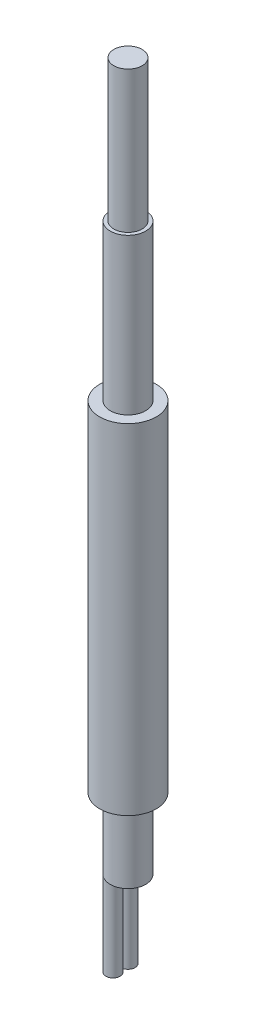
ISO-10303-21;
HEADER;
FILE_DESCRIPTION(('STEP AP214'),'2;1');
FILE_NAME('part.step','',(''),(''),'','','');
FILE_SCHEMA(('AUTOMOTIVE_DESIGN { 1 0 10303 214 1 1 1 1 }'));
ENDSEC;
DATA;
#1=APPLICATION_CONTEXT('core data for automotive mechanical design processes');
#2=APPLICATION_PROTOCOL_DEFINITION('international standard','automotive_design',2000,#1);
#3=PRODUCT_CONTEXT('',#1,'mechanical');
#4=PRODUCT('Part','Part','',(#3));
#5=PRODUCT_RELATED_PRODUCT_CATEGORY('part','',(#4));
#6=PRODUCT_DEFINITION_FORMATION('','',#4);
#7=PRODUCT_DEFINITION_CONTEXT('part definition',#1,'design');
#8=PRODUCT_DEFINITION('design','',#6,#7);
#9=PRODUCT_DEFINITION_SHAPE('','',#8);
#10=(LENGTH_UNIT() NAMED_UNIT(*) SI_UNIT(.MILLI.,.METRE.));
#11=(NAMED_UNIT(*) PLANE_ANGLE_UNIT() SI_UNIT($,.RADIAN.));
#12=(NAMED_UNIT(*) SI_UNIT($,.STERADIAN.) SOLID_ANGLE_UNIT());
#13=UNCERTAINTY_MEASURE_WITH_UNIT(LENGTH_MEASURE(1.E-05),#10,'distance_accuracy_value','');
#14=(GEOMETRIC_REPRESENTATION_CONTEXT(3) GLOBAL_UNCERTAINTY_ASSIGNED_CONTEXT((#13)) GLOBAL_UNIT_ASSIGNED_CONTEXT((#10,
#11,#12)) REPRESENTATION_CONTEXT('',''));
#15=CARTESIAN_POINT('',(0.,0.,0.));
#16=DIRECTION('',(0.,0.,1.));
#17=DIRECTION('',(1.,0.,0.));
#18=AXIS2_PLACEMENT_3D('',#15,#16,#17);
#19=CARTESIAN_POINT('',(0.,14.5,0.));
#20=DIRECTION('',(0.,1.,0.));
#21=DIRECTION('',(0.,0.,1.));
#22=AXIS2_PLACEMENT_3D('',#19,#20,#21);
#23=PLANE('',#22);
#24=CARTESIAN_POINT('',(0.,14.5,0.));
#25=DIRECTION('',(0.,1.,0.));
#26=DIRECTION('',(0.,0.,1.));
#27=AXIS2_PLACEMENT_3D('',#24,#25,#26);
#28=CIRCLE('',#27,1.);
#29=CARTESIAN_POINT('',(0.,14.5,1.));
#30=VERTEX_POINT('',#29);
#31=EDGE_CURVE('E12',#30,#30,#28,.T.);
#32=ORIENTED_EDGE('',*,*,#31,.T.);
#33=EDGE_LOOP('',(#32));
#34=FACE_BOUND('',#33,.T.);
#35=CARTESIAN_POINT('',(0.,14.5,0.));
#36=DIRECTION('',(0.,1.,0.));
#37=DIRECTION('',(1.,0.,0.));
#38=AXIS2_PLACEMENT_3D('',#35,#36,#37);
#39=CIRCLE('',#38,0.625);
#40=CARTESIAN_POINT('',(0.625,14.5,0.));
#41=VERTEX_POINT('',#40);
#42=EDGE_CURVE('E59',#41,#41,#39,.T.);
#43=ORIENTED_EDGE('',*,*,#42,.F.);
#44=EDGE_LOOP('',(#43));
#45=FACE_BOUND('',#44,.T.);
#46=ADVANCED_FACE('F48',(#34,#45),#23,.T.);
#47=CARTESIAN_POINT('',(0.,2.5,0.));
#48=DIRECTION('',(0.,1.,0.));
#49=DIRECTION('',(0.,0.,1.));
#50=AXIS2_PLACEMENT_3D('',#47,#48,#49);
#51=PLANE('',#50);
#52=CARTESIAN_POINT('',(0.,2.5,0.));
#53=DIRECTION('',(0.,1.,0.));
#54=DIRECTION('',(0.,0.,1.));
#55=AXIS2_PLACEMENT_3D('',#52,#53,#54);
#56=CIRCLE('',#55,1.);
#57=CARTESIAN_POINT('',(0.,2.5,1.));
#58=VERTEX_POINT('',#57);
#59=EDGE_CURVE('E52',#58,#58,#56,.T.);
#60=ORIENTED_EDGE('',*,*,#59,.F.);
#61=EDGE_LOOP('',(#60));
#62=FACE_BOUND('',#61,.T.);
#63=CARTESIAN_POINT('',(0.,2.5,0.));
#64=DIRECTION('',(0.,1.,0.));
#65=DIRECTION('',(1.,0.,0.));
#66=AXIS2_PLACEMENT_3D('',#63,#64,#65);
#67=CIRCLE('',#66,0.625);
#68=CARTESIAN_POINT('',(0.625,2.5,0.));
#69=VERTEX_POINT('',#68);
#70=EDGE_CURVE('E61',#69,#69,#67,.T.);
#71=ORIENTED_EDGE('',*,*,#70,.T.);
#72=EDGE_LOOP('',(#71));
#73=FACE_BOUND('',#72,.T.);
#74=ADVANCED_FACE('F71',(#62,#73),#51,.F.);
#75=CARTESIAN_POINT('',(0.,14.5,0.));
#76=DIRECTION('',(0.,-1.,0.));
#77=DIRECTION('',(0.,0.,-1.));
#78=AXIS2_PLACEMENT_3D('',#75,#76,#77);
#79=CYLINDRICAL_SURFACE('',#78,1.);
#80=ORIENTED_EDGE('',*,*,#31,.F.);
#81=EDGE_LOOP('',(#80));
#82=FACE_BOUND('',#81,.T.);
#83=ORIENTED_EDGE('',*,*,#59,.T.);
#84=EDGE_LOOP('',(#83));
#85=FACE_BOUND('',#84,.T.);
#86=ADVANCED_FACE('F50',(#82,#85),#79,.T.);
#87=CARTESIAN_POINT('',(0.,14.5,0.));
#88=DIRECTION('',(0.,-1.,0.));
#89=DIRECTION('',(0.,0.,-1.));
#90=AXIS2_PLACEMENT_3D('',#87,#88,#89);
#91=CYLINDRICAL_SURFACE('',#90,0.625);
#92=ORIENTED_EDGE('',*,*,#42,.T.);
#93=EDGE_LOOP('',(#92));
#94=FACE_BOUND('',#93,.T.);
#95=ORIENTED_EDGE('',*,*,#70,.F.);
#96=EDGE_LOOP('',(#95));
#97=FACE_BOUND('',#96,.T.);
#98=ADVANCED_FACE('F67',(#94,#97),#91,.F.);
#99=CLOSED_SHELL('',(#46,#74,#86,#98));
#100=MANIFOLD_SOLID_BREP('B2',#99);
#101=CARTESIAN_POINT('',(0.,-1.4142135623731,0.));
#102=DIRECTION('',(0.,1.,0.));
#103=DIRECTION('',(0.,0.,1.));
#104=AXIS2_PLACEMENT_3D('',#101,#102,#103);
#105=CYLINDRICAL_SURFACE('',#104,0.5);
#106=CARTESIAN_POINT('',(0.,0.,0.));
#107=DIRECTION('',(0.,1.,0.));
#108=DIRECTION('',(0.,0.,1.));
#109=AXIS2_PLACEMENT_3D('',#106,#107,#108);
#110=CIRCLE('',#109,0.5);
#111=CARTESIAN_POINT('',(0.,0.,0.5));
#112=VERTEX_POINT('',#111);
#113=EDGE_CURVE('E47',#112,#112,#110,.F.);
#114=ORIENTED_EDGE('',*,*,#113,.F.);
#115=EDGE_LOOP('',(#114));
#116=FACE_BOUND('',#115,.T.);
#117=CARTESIAN_POINT('',(0.,25.,0.));
#118=DIRECTION('',(0.,1.,0.));
#119=DIRECTION('',(0.,0.,1.));
#120=AXIS2_PLACEMENT_3D('',#117,#118,#119);
#121=CIRCLE('',#120,0.5);
#122=CARTESIAN_POINT('',(0.,25.,0.5));
#123=VERTEX_POINT('',#122);
#124=EDGE_CURVE('E125',#123,#123,#121,.T.);
#125=ORIENTED_EDGE('',*,*,#124,.F.);
#126=EDGE_LOOP('',(#125));
#127=FACE_BOUND('',#126,.T.);
#128=ADVANCED_FACE('F119',(#116,#127),#105,.T.);
#129=CARTESIAN_POINT('',(0.,0.,0.));
#130=DIRECTION('',(0.,1.,0.));
#131=DIRECTION('',(0.,0.,1.));
#132=AXIS2_PLACEMENT_3D('',#129,#130,#131);
#133=PLANE('',#132);
#134=ORIENTED_EDGE('',*,*,#113,.T.);
#135=EDGE_LOOP('',(#134));
#136=FACE_BOUND('',#135,.T.);
#137=ADVANCED_FACE('F134',(#136),#133,.F.);
#138=CARTESIAN_POINT('',(0.,25.,0.));
#139=DIRECTION('',(0.,1.,0.));
#140=DIRECTION('',(0.,0.,1.));
#141=AXIS2_PLACEMENT_3D('',#138,#139,#140);
#142=PLANE('',#141);
#143=ORIENTED_EDGE('',*,*,#124,.T.);
#144=EDGE_LOOP('',(#143));
#145=FACE_BOUND('',#144,.T.);
#146=ADVANCED_FACE('F131',(#145),#142,.T.);
#147=CLOSED_SHELL('',(#128,#137,#146));
#148=MANIFOLD_SOLID_BREP('B7',#147);
#149=CARTESIAN_POINT('',(0.,0.,0.));
#150=DIRECTION('',(0.,1.,0.));
#151=DIRECTION('',(0.,0.,1.));
#152=AXIS2_PLACEMENT_3D('',#149,#150,#151);
#153=PLANE('',#152);
#154=CARTESIAN_POINT('',(-0.265165042944956,0.,0.265165042944955));
#155=DIRECTION('',(0.,-1.,0.));
#156=DIRECTION('',(0.,0.,1.));
#157=AXIS2_PLACEMENT_3D('',#154,#155,#156);
#158=CIRCLE('',#157,0.25);
#159=CARTESIAN_POINT('',(-0.441941738241593,0.,0.441941738241591));
#160=VERTEX_POINT('',#159);
#161=CARTESIAN_POINT('',(-0.480522515989479,0.,0.138195917548749));
#162=VERTEX_POINT('',#161);
#163=EDGE_CURVE('E178',#160,#162,#158,.T.);
#164=ORIENTED_EDGE('',*,*,#163,.F.);
#165=CARTESIAN_POINT('',(0.,0.,0.));
#166=DIRECTION('',(0.,1.,0.));
#167=DIRECTION('',(0.,0.,1.));
#168=AXIS2_PLACEMENT_3D('',#165,#166,#167);
#169=CIRCLE('',#168,0.625);
#170=CARTESIAN_POINT('',(-0.441941738241593,0.,-0.441941738241592));
#171=VERTEX_POINT('',#170);
#172=EDGE_CURVE('E164',#171,#160,#169,.T.);
#173=ORIENTED_EDGE('',*,*,#172,.F.);
#174=CARTESIAN_POINT('',(-0.265165042944956,0.,-0.265165042944955));
#175=DIRECTION('',(0.,-1.,0.));
#176=DIRECTION('',(0.,0.,-1.));
#177=AXIS2_PLACEMENT_3D('',#174,#175,#176);
#178=CIRCLE('',#177,0.25);
#179=CARTESIAN_POINT('',(-0.480522515989479,0.,-0.13819591754875));
#180=VERTEX_POINT('',#179);
#181=EDGE_CURVE('E117',#180,#171,#178,.T.);
#182=ORIENTED_EDGE('',*,*,#181,.F.);
#183=CARTESIAN_POINT('',(0.,0.,0.));
#184=DIRECTION('',(0.,1.,0.));
#185=DIRECTION('',(0.,0.,1.));
#186=AXIS2_PLACEMENT_3D('',#183,#184,#185);
#187=CIRCLE('',#186,0.5);
#188=EDGE_CURVE('E220',#180,#162,#187,.T.);
#189=ORIENTED_EDGE('',*,*,#188,.T.);
#190=EDGE_LOOP('',(#164,#173,#182,#189));
#191=FACE_BOUND('',#190,.T.);
#192=ADVANCED_FACE('F160',(#191),#153,.F.);
#193=CARTESIAN_POINT('',(0.,20.,0.));
#194=DIRECTION('',(0.,1.,0.));
#195=DIRECTION('',(0.,0.,1.));
#196=AXIS2_PLACEMENT_3D('',#193,#194,#195);
#197=PLANE('',#196);
#198=CARTESIAN_POINT('',(0.,20.,0.));
#199=DIRECTION('',(0.,1.,0.));
#200=DIRECTION('',(0.,0.,1.));
#201=AXIS2_PLACEMENT_3D('',#198,#199,#200);
#202=CIRCLE('',#201,0.625);
#203=CARTESIAN_POINT('',(0.,20.,0.625));
#204=VERTEX_POINT('',#203);
#205=EDGE_CURVE('E230',#204,#204,#202,.T.);
#206=ORIENTED_EDGE('',*,*,#205,.T.);
#207=EDGE_LOOP('',(#206));
#208=FACE_BOUND('',#207,.T.);
#209=CARTESIAN_POINT('',(0.,20.,0.));
#210=DIRECTION('',(0.,1.,0.));
#211=DIRECTION('',(0.,0.,1.));
#212=AXIS2_PLACEMENT_3D('',#209,#210,#211);
#213=CIRCLE('',#212,0.5);
#214=CARTESIAN_POINT('',(0.,20.,0.5));
#215=VERTEX_POINT('',#214);
#216=EDGE_CURVE('E228',#215,#215,#213,.T.);
#217=ORIENTED_EDGE('',*,*,#216,.F.);
#218=EDGE_LOOP('',(#217));
#219=FACE_BOUND('',#218,.T.);
#220=ADVANCED_FACE('F253',(#208,#219),#197,.T.);
#221=CARTESIAN_POINT('',(-0.138195917548751,0.,0.480522515989479));
#222=VERTEX_POINT('',#221);
#223=EDGE_CURVE('E209',#222,#160,#158,.T.);
#224=ORIENTED_EDGE('',*,*,#223,.F.);
#225=CARTESIAN_POINT('',(-0.138195917548751,0.,-0.480522515989479));
#226=VERTEX_POINT('',#225);
#227=EDGE_CURVE('E198',#222,#226,#187,.T.);
#228=ORIENTED_EDGE('',*,*,#227,.T.);
#229=EDGE_CURVE('E169',#171,#226,#178,.T.);
#230=ORIENTED_EDGE('',*,*,#229,.F.);
#231=EDGE_CURVE('E211',#160,#171,#169,.T.);
#232=ORIENTED_EDGE('',*,*,#231,.F.);
#233=EDGE_LOOP('',(#224,#228,#230,#232));
#234=FACE_BOUND('',#233,.T.);
#235=ADVANCED_FACE('F210',(#234),#153,.F.);
#236=CARTESIAN_POINT('',(0.,20.,0.));
#237=DIRECTION('',(0.,-1.,0.));
#238=DIRECTION('',(0.,0.,-1.));
#239=AXIS2_PLACEMENT_3D('',#236,#237,#238);
#240=CYLINDRICAL_SURFACE('',#239,0.625);
#241=ORIENTED_EDGE('',*,*,#205,.F.);
#242=EDGE_LOOP('',(#241));
#243=FACE_BOUND('',#242,.T.);
#244=ORIENTED_EDGE('',*,*,#172,.T.);
#245=ORIENTED_EDGE('',*,*,#231,.T.);
#246=EDGE_LOOP('',(#244,#245));
#247=FACE_BOUND('',#246,.T.);
#248=ADVANCED_FACE('F162',(#243,#247),#240,.T.);
#249=CARTESIAN_POINT('',(0.,20.,0.));
#250=DIRECTION('',(0.,-1.,0.));
#251=DIRECTION('',(0.,0.,-1.));
#252=AXIS2_PLACEMENT_3D('',#249,#250,#251);
#253=CYLINDRICAL_SURFACE('',#252,0.5);
#254=ORIENTED_EDGE('',*,*,#216,.T.);
#255=EDGE_LOOP('',(#254));
#256=FACE_BOUND('',#255,.T.);
#257=EDGE_CURVE('E202',#226,#180,#187,.T.);
#258=ORIENTED_EDGE('',*,*,#257,.F.);
#259=ORIENTED_EDGE('',*,*,#227,.F.);
#260=EDGE_CURVE('E186',#162,#222,#187,.T.);
#261=ORIENTED_EDGE('',*,*,#260,.F.);
#262=ORIENTED_EDGE('',*,*,#188,.F.);
#263=EDGE_LOOP('',(#258,#259,#261,#262));
#264=FACE_BOUND('',#263,.T.);
#265=ADVANCED_FACE('F200',(#256,#264),#253,.F.);
#266=CARTESIAN_POINT('',(-0.265165042944956,0.,-0.265165042944955));
#267=DIRECTION('',(0.,-1.,0.));
#268=DIRECTION('',(0.,0.,-1.));
#269=AXIS2_PLACEMENT_3D('',#266,#267,#268);
#270=PLANE('',#269);
#271=EDGE_CURVE('E171',#226,#180,#178,.T.);
#272=ORIENTED_EDGE('',*,*,#271,.F.);
#273=ORIENTED_EDGE('',*,*,#257,.T.);
#274=EDGE_LOOP('',(#272,#273));
#275=FACE_BOUND('',#274,.T.);
#276=ADVANCED_FACE('F239',(#275),#270,.F.);
#277=CARTESIAN_POINT('',(-0.265165042944956,-3.,-0.265165042944955));
#278=DIRECTION('',(0.,1.,0.));
#279=DIRECTION('',(0.,0.,1.));
#280=AXIS2_PLACEMENT_3D('',#277,#278,#279);
#281=CYLINDRICAL_SURFACE('',#280,0.25);
#282=CARTESIAN_POINT('',(-0.265165042944956,-3.,-0.265165042944955));
#283=DIRECTION('',(0.,-1.,0.));
#284=DIRECTION('',(0.,0.,-1.));
#285=AXIS2_PLACEMENT_3D('',#282,#283,#284);
#286=CIRCLE('',#285,0.25);
#287=CARTESIAN_POINT('',(-0.265165042944956,-3.,-0.515165042944955));
#288=VERTEX_POINT('',#287);
#289=EDGE_CURVE('E206',#288,#288,#286,.T.);
#290=ORIENTED_EDGE('',*,*,#289,.F.);
#291=EDGE_LOOP('',(#290));
#292=FACE_BOUND('',#291,.T.);
#293=ORIENTED_EDGE('',*,*,#271,.T.);
#294=ORIENTED_EDGE('',*,*,#181,.T.);
#295=ORIENTED_EDGE('',*,*,#229,.T.);
#296=EDGE_LOOP('',(#293,#294,#295));
#297=FACE_BOUND('',#296,.T.);
#298=ADVANCED_FACE('F237',(#292,#297),#281,.T.);
#299=CARTESIAN_POINT('',(-0.265165042944956,-3.,-0.265165042944955));
#300=DIRECTION('',(0.,-1.,0.));
#301=DIRECTION('',(0.,0.,-1.));
#302=AXIS2_PLACEMENT_3D('',#299,#300,#301);
#303=PLANE('',#302);
#304=ORIENTED_EDGE('',*,*,#289,.T.);
#305=EDGE_LOOP('',(#304));
#306=FACE_BOUND('',#305,.T.);
#307=ADVANCED_FACE('F246',(#306),#303,.T.);
#308=CARTESIAN_POINT('',(-0.265165042944956,0.,0.265165042944955));
#309=DIRECTION('',(0.,1.,0.));
#310=DIRECTION('',(0.,0.,1.));
#311=AXIS2_PLACEMENT_3D('',#308,#309,#310);
#312=PLANE('',#311);
#313=EDGE_CURVE('E215',#162,#222,#158,.T.);
#314=ORIENTED_EDGE('',*,*,#313,.F.);
#315=ORIENTED_EDGE('',*,*,#260,.T.);
#316=EDGE_LOOP('',(#314,#315));
#317=FACE_BOUND('',#316,.T.);
#318=ADVANCED_FACE('F219',(#317),#312,.T.);
#319=CARTESIAN_POINT('',(-0.265165042944956,-3.,0.265165042944955));
#320=DIRECTION('',(0.,1.,0.));
#321=DIRECTION('',(0.,0.,1.));
#322=AXIS2_PLACEMENT_3D('',#319,#320,#321);
#323=CYLINDRICAL_SURFACE('',#322,0.25);
#324=CARTESIAN_POINT('',(-0.265165042944956,-3.,0.265165042944955));
#325=DIRECTION('',(0.,-1.,0.));
#326=DIRECTION('',(0.,0.,1.));
#327=AXIS2_PLACEMENT_3D('',#324,#325,#326);
#328=CIRCLE('',#327,0.25);
#329=CARTESIAN_POINT('',(-0.265165042944956,-3.,0.515165042944955));
#330=VERTEX_POINT('',#329);
#331=EDGE_CURVE('E222',#330,#330,#328,.T.);
#332=ORIENTED_EDGE('',*,*,#331,.F.);
#333=EDGE_LOOP('',(#332));
#334=FACE_BOUND('',#333,.T.);
#335=ORIENTED_EDGE('',*,*,#163,.T.);
#336=ORIENTED_EDGE('',*,*,#313,.T.);
#337=ORIENTED_EDGE('',*,*,#223,.T.);
#338=EDGE_LOOP('',(#335,#336,#337));
#339=FACE_BOUND('',#338,.T.);
#340=ADVANCED_FACE('F221',(#334,#339),#323,.T.);
#341=CARTESIAN_POINT('',(-0.265165042944956,-3.,0.265165042944955));
#342=DIRECTION('',(0.,1.,0.));
#343=DIRECTION('',(0.,0.,1.));
#344=AXIS2_PLACEMENT_3D('',#341,#342,#343);
#345=PLANE('',#344);
#346=ORIENTED_EDGE('',*,*,#331,.T.);
#347=EDGE_LOOP('',(#346));
#348=FACE_BOUND('',#347,.T.);
#349=ADVANCED_FACE('F306',(#348),#345,.F.);
#350=CLOSED_SHELL('',(#192,#220,#235,#248,#265,#276,#298,#307,#318,#340,#349));
#351=MANIFOLD_SOLID_BREP('B42',#350);
#352=ADVANCED_BREP_SHAPE_REPRESENTATION('',(#18,#100,#148,#351),#14);
#353=SHAPE_DEFINITION_REPRESENTATION(#9,#352);
ENDSEC;
END-ISO-10303-21;
